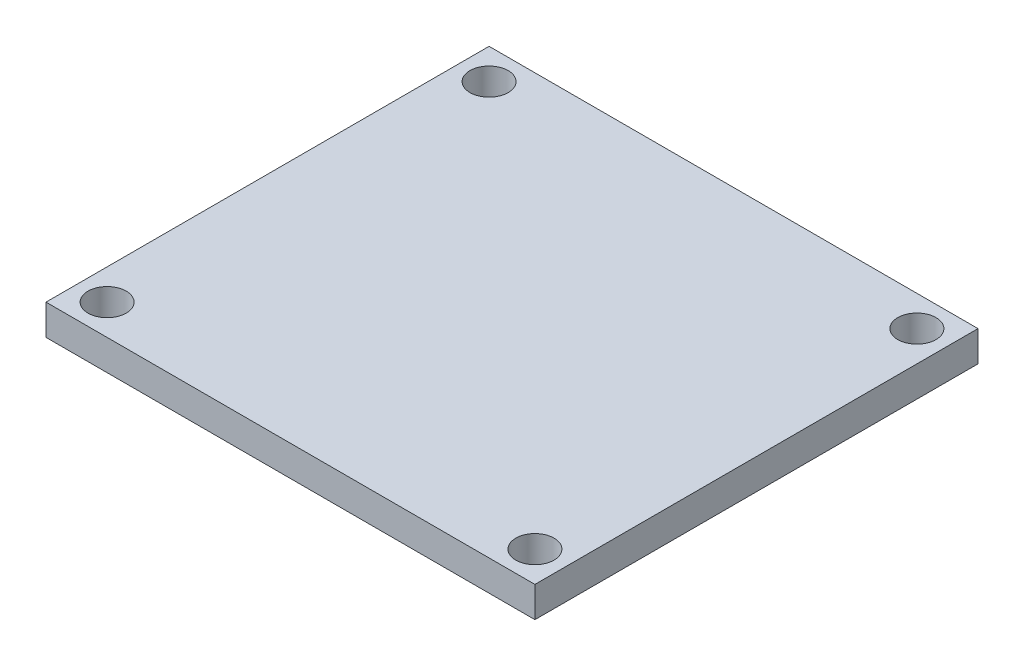
ISO-10303-21;
HEADER;
FILE_DESCRIPTION(('STEP AP214'),'2;1');
FILE_NAME('part.step','',(''),(''),'','','');
FILE_SCHEMA(('AUTOMOTIVE_DESIGN { 1 0 10303 214 1 1 1 1 }'));
ENDSEC;
DATA;
#1=APPLICATION_CONTEXT('core data for automotive mechanical design processes');
#2=APPLICATION_PROTOCOL_DEFINITION('international standard','automotive_design',2000,#1);
#3=PRODUCT_CONTEXT('',#1,'mechanical');
#4=PRODUCT('Part','Part','',(#3));
#5=PRODUCT_RELATED_PRODUCT_CATEGORY('part','',(#4));
#6=PRODUCT_DEFINITION_FORMATION('','',#4);
#7=PRODUCT_DEFINITION_CONTEXT('part definition',#1,'design');
#8=PRODUCT_DEFINITION('design','',#6,#7);
#9=PRODUCT_DEFINITION_SHAPE('','',#8);
#10=(LENGTH_UNIT() NAMED_UNIT(*) SI_UNIT(.MILLI.,.METRE.));
#11=(NAMED_UNIT(*) PLANE_ANGLE_UNIT() SI_UNIT($,.RADIAN.));
#12=(NAMED_UNIT(*) SI_UNIT($,.STERADIAN.) SOLID_ANGLE_UNIT());
#13=UNCERTAINTY_MEASURE_WITH_UNIT(LENGTH_MEASURE(1.E-05),#10,'distance_accuracy_value','');
#14=(GEOMETRIC_REPRESENTATION_CONTEXT(3) GLOBAL_UNCERTAINTY_ASSIGNED_CONTEXT((#13)) GLOBAL_UNIT_ASSIGNED_CONTEXT((#10,
#11,#12)) REPRESENTATION_CONTEXT('',''));
#15=CARTESIAN_POINT('',(0.,0.,0.));
#16=DIRECTION('',(0.,0.,1.));
#17=DIRECTION('',(1.,0.,0.));
#18=AXIS2_PLACEMENT_3D('',#15,#16,#17);
#19=CARTESIAN_POINT('',(0.,2.54,0.));
#20=DIRECTION('',(0.,1.,0.));
#21=DIRECTION('',(0.,0.,1.));
#22=AXIS2_PLACEMENT_3D('',#19,#20,#21);
#23=PLANE('',#22);
#24=CARTESIAN_POINT('',(38.1,2.54,2.54));
#25=DIRECTION('',(0.,1.,0.));
#26=DIRECTION('',(0.,0.,1.));
#27=AXIS2_PLACEMENT_3D('',#24,#25,#26);
#28=CIRCLE('',#27,1.5875);
#29=CARTESIAN_POINT('',(38.1,2.54,4.1275));
#30=VERTEX_POINT('',#29);
#31=EDGE_CURVE('E142',#30,#30,#28,.T.);
#32=ORIENTED_EDGE('',*,*,#31,.F.);
#33=EDGE_LOOP('',(#32));
#34=FACE_BOUND('',#33,.T.);
#35=CARTESIAN_POINT('',(2.54,2.54,2.54));
#36=DIRECTION('',(0.,1.,0.));
#37=DIRECTION('',(0.,0.,1.));
#38=AXIS2_PLACEMENT_3D('',#35,#36,#37);
#39=CIRCLE('',#38,1.58750000000004);
#40=CARTESIAN_POINT('',(2.54,2.54,4.12750000000004));
#41=VERTEX_POINT('',#40);
#42=EDGE_CURVE('E112',#41,#41,#39,.T.);
#43=ORIENTED_EDGE('',*,*,#42,.F.);
#44=EDGE_LOOP('',(#43));
#45=FACE_BOUND('',#44,.T.);
#46=DIRECTION('',(0.,0.,1.));
#47=VECTOR('',#46,1.);
#48=CARTESIAN_POINT('',(0.,2.54,0.));
#49=LINE('',#48,#47);
#50=CARTESIAN_POINT('',(0.,2.54,0.));
#51=VERTEX_POINT('',#50);
#52=CARTESIAN_POINT('',(0.,2.54,36.83));
#53=VERTEX_POINT('',#52);
#54=EDGE_CURVE('E92',#51,#53,#49,.T.);
#55=ORIENTED_EDGE('',*,*,#54,.T.);
#56=DIRECTION('',(1.,0.,0.));
#57=VECTOR('',#56,1.);
#58=CARTESIAN_POINT('',(0.,2.54,36.83));
#59=LINE('',#58,#57);
#60=CARTESIAN_POINT('',(40.64,2.54,36.83));
#61=VERTEX_POINT('',#60);
#62=EDGE_CURVE('E87',#53,#61,#59,.T.);
#63=ORIENTED_EDGE('',*,*,#62,.T.);
#64=DIRECTION('',(0.,0.,-1.));
#65=VECTOR('',#64,1.);
#66=CARTESIAN_POINT('',(40.64,2.54,0.));
#67=LINE('',#66,#65);
#68=CARTESIAN_POINT('',(40.64,2.54,0.));
#69=VERTEX_POINT('',#68);
#70=EDGE_CURVE('E90',#61,#69,#67,.T.);
#71=ORIENTED_EDGE('',*,*,#70,.T.);
#72=DIRECTION('',(-1.,0.,0.));
#73=VECTOR('',#72,1.);
#74=CARTESIAN_POINT('',(0.,2.54,0.));
#75=LINE('',#74,#73);
#76=EDGE_CURVE('E57',#69,#51,#75,.T.);
#77=ORIENTED_EDGE('',*,*,#76,.T.);
#78=EDGE_LOOP('',(#55,#63,#71,#77));
#79=FACE_BOUND('',#78,.T.);
#80=CARTESIAN_POINT('',(2.54,2.54,34.29));
#81=DIRECTION('',(0.,1.,0.));
#82=DIRECTION('',(0.,0.,1.));
#83=AXIS2_PLACEMENT_3D('',#80,#81,#82);
#84=CIRCLE('',#83,1.5875);
#85=CARTESIAN_POINT('',(2.54,2.54,35.8775));
#86=VERTEX_POINT('',#85);
#87=EDGE_CURVE('E134',#86,#86,#84,.T.);
#88=ORIENTED_EDGE('',*,*,#87,.F.);
#89=EDGE_LOOP('',(#88));
#90=FACE_BOUND('',#89,.T.);
#91=CARTESIAN_POINT('',(38.1,2.54,34.29));
#92=DIRECTION('',(0.,1.,0.));
#93=DIRECTION('',(0.,0.,1.));
#94=AXIS2_PLACEMENT_3D('',#91,#92,#93);
#95=CIRCLE('',#94,1.58750000000001);
#96=CARTESIAN_POINT('',(38.1,2.54,35.8775));
#97=VERTEX_POINT('',#96);
#98=EDGE_CURVE('E150',#97,#97,#95,.T.);
#99=ORIENTED_EDGE('',*,*,#98,.F.);
#100=EDGE_LOOP('',(#99));
#101=FACE_BOUND('',#100,.T.);
#102=ADVANCED_FACE('F39',(#34,#45,#79,#90,#101),#23,.T.);
#103=CARTESIAN_POINT('',(0.,0.,0.));
#104=DIRECTION('',(0.,1.,0.));
#105=DIRECTION('',(0.,0.,1.));
#106=AXIS2_PLACEMENT_3D('',#103,#104,#105);
#107=PLANE('',#106);
#108=DIRECTION('',(0.,0.,1.));
#109=VECTOR('',#108,1.);
#110=CARTESIAN_POINT('',(0.,0.,0.));
#111=LINE('',#110,#109);
#112=CARTESIAN_POINT('',(0.,0.,0.));
#113=VERTEX_POINT('',#112);
#114=CARTESIAN_POINT('',(0.,0.,36.83));
#115=VERTEX_POINT('',#114);
#116=EDGE_CURVE('E108',#113,#115,#111,.T.);
#117=ORIENTED_EDGE('',*,*,#116,.F.);
#118=DIRECTION('',(-1.,0.,0.));
#119=VECTOR('',#118,1.);
#120=CARTESIAN_POINT('',(0.,0.,0.));
#121=LINE('',#120,#119);
#122=CARTESIAN_POINT('',(40.64,0.,0.));
#123=VERTEX_POINT('',#122);
#124=EDGE_CURVE('E80',#123,#113,#121,.T.);
#125=ORIENTED_EDGE('',*,*,#124,.F.);
#126=DIRECTION('',(0.,0.,-1.));
#127=VECTOR('',#126,1.);
#128=CARTESIAN_POINT('',(40.64,0.,0.));
#129=LINE('',#128,#127);
#130=CARTESIAN_POINT('',(40.64,0.,36.83));
#131=VERTEX_POINT('',#130);
#132=EDGE_CURVE('E74',#131,#123,#129,.T.);
#133=ORIENTED_EDGE('',*,*,#132,.F.);
#134=DIRECTION('',(1.,0.,0.));
#135=VECTOR('',#134,1.);
#136=CARTESIAN_POINT('',(0.,0.,36.83));
#137=LINE('',#136,#135);
#138=EDGE_CURVE('E97',#115,#131,#137,.T.);
#139=ORIENTED_EDGE('',*,*,#138,.F.);
#140=EDGE_LOOP('',(#117,#125,#133,#139));
#141=FACE_BOUND('',#140,.T.);
#142=CARTESIAN_POINT('',(2.54,0.,2.54));
#143=DIRECTION('',(0.,1.,0.));
#144=DIRECTION('',(0.,0.,1.));
#145=AXIS2_PLACEMENT_3D('',#142,#143,#144);
#146=CIRCLE('',#145,1.58750000000004);
#147=CARTESIAN_POINT('',(2.54,0.,4.12750000000004));
#148=VERTEX_POINT('',#147);
#149=EDGE_CURVE('E130',#148,#148,#146,.T.);
#150=ORIENTED_EDGE('',*,*,#149,.T.);
#151=EDGE_LOOP('',(#150));
#152=FACE_BOUND('',#151,.T.);
#153=CARTESIAN_POINT('',(2.54,0.,34.29));
#154=DIRECTION('',(0.,1.,0.));
#155=DIRECTION('',(0.,0.,1.));
#156=AXIS2_PLACEMENT_3D('',#153,#154,#155);
#157=CIRCLE('',#156,1.5875);
#158=CARTESIAN_POINT('',(2.54,0.,35.8775));
#159=VERTEX_POINT('',#158);
#160=EDGE_CURVE('E138',#159,#159,#157,.T.);
#161=ORIENTED_EDGE('',*,*,#160,.T.);
#162=EDGE_LOOP('',(#161));
#163=FACE_BOUND('',#162,.T.);
#164=CARTESIAN_POINT('',(38.1,0.,2.54));
#165=DIRECTION('',(0.,1.,0.));
#166=DIRECTION('',(0.,0.,1.));
#167=AXIS2_PLACEMENT_3D('',#164,#165,#166);
#168=CIRCLE('',#167,1.5875);
#169=CARTESIAN_POINT('',(38.1,0.,4.1275));
#170=VERTEX_POINT('',#169);
#171=EDGE_CURVE('E146',#170,#170,#168,.T.);
#172=ORIENTED_EDGE('',*,*,#171,.T.);
#173=EDGE_LOOP('',(#172));
#174=FACE_BOUND('',#173,.T.);
#175=CARTESIAN_POINT('',(38.1,0.,34.29));
#176=DIRECTION('',(0.,1.,0.));
#177=DIRECTION('',(0.,0.,1.));
#178=AXIS2_PLACEMENT_3D('',#175,#176,#177);
#179=CIRCLE('',#178,1.58750000000001);
#180=CARTESIAN_POINT('',(38.1,0.,35.8775));
#181=VERTEX_POINT('',#180);
#182=EDGE_CURVE('E154',#181,#181,#179,.T.);
#183=ORIENTED_EDGE('',*,*,#182,.T.);
#184=EDGE_LOOP('',(#183));
#185=FACE_BOUND('',#184,.T.);
#186=ADVANCED_FACE('F125',(#141,#152,#163,#174,#185),#107,.F.);
#187=CARTESIAN_POINT('',(0.,2.54,0.));
#188=DIRECTION('',(1.,0.,0.));
#189=DIRECTION('',(0.,0.,-1.));
#190=AXIS2_PLACEMENT_3D('',#187,#188,#189);
#191=PLANE('',#190);
#192=ORIENTED_EDGE('',*,*,#116,.T.);
#193=DIRECTION('',(0.,-1.,0.));
#194=VECTOR('',#193,1.);
#195=CARTESIAN_POINT('',(0.,2.54,36.83));
#196=LINE('',#195,#194);
#197=EDGE_CURVE('E11',#53,#115,#196,.T.);
#198=ORIENTED_EDGE('',*,*,#197,.F.);
#199=ORIENTED_EDGE('',*,*,#54,.F.);
#200=DIRECTION('',(0.,-1.,0.));
#201=VECTOR('',#200,1.);
#202=CARTESIAN_POINT('',(0.,2.54,0.));
#203=LINE('',#202,#201);
#204=EDGE_CURVE('E104',#51,#113,#203,.T.);
#205=ORIENTED_EDGE('',*,*,#204,.T.);
#206=EDGE_LOOP('',(#192,#198,#199,#205));
#207=FACE_BOUND('',#206,.T.);
#208=ADVANCED_FACE('F41',(#207),#191,.F.);
#209=CARTESIAN_POINT('',(0.,2.54,36.83));
#210=DIRECTION('',(0.,0.,-1.));
#211=DIRECTION('',(-1.,0.,0.));
#212=AXIS2_PLACEMENT_3D('',#209,#210,#211);
#213=PLANE('',#212);
#214=ORIENTED_EDGE('',*,*,#138,.T.);
#215=DIRECTION('',(0.,-1.,0.));
#216=VECTOR('',#215,1.);
#217=CARTESIAN_POINT('',(40.64,2.54,36.83));
#218=LINE('',#217,#216);
#219=EDGE_CURVE('E49',#61,#131,#218,.T.);
#220=ORIENTED_EDGE('',*,*,#219,.F.);
#221=ORIENTED_EDGE('',*,*,#62,.F.);
#222=ORIENTED_EDGE('',*,*,#197,.T.);
#223=EDGE_LOOP('',(#214,#220,#221,#222));
#224=FACE_BOUND('',#223,.T.);
#225=ADVANCED_FACE('F96',(#224),#213,.F.);
#226=CARTESIAN_POINT('',(40.64,2.54,0.));
#227=DIRECTION('',(-1.,0.,0.));
#228=DIRECTION('',(0.,0.,1.));
#229=AXIS2_PLACEMENT_3D('',#226,#227,#228);
#230=PLANE('',#229);
#231=ORIENTED_EDGE('',*,*,#132,.T.);
#232=DIRECTION('',(0.,-1.,0.));
#233=VECTOR('',#232,1.);
#234=CARTESIAN_POINT('',(40.64,2.54,0.));
#235=LINE('',#234,#233);
#236=EDGE_CURVE('E99',#69,#123,#235,.T.);
#237=ORIENTED_EDGE('',*,*,#236,.F.);
#238=ORIENTED_EDGE('',*,*,#70,.F.);
#239=ORIENTED_EDGE('',*,*,#219,.T.);
#240=EDGE_LOOP('',(#231,#237,#238,#239));
#241=FACE_BOUND('',#240,.T.);
#242=ADVANCED_FACE('F100',(#241),#230,.F.);
#243=CARTESIAN_POINT('',(0.,2.54,0.));
#244=DIRECTION('',(0.,0.,1.));
#245=DIRECTION('',(1.,0.,0.));
#246=AXIS2_PLACEMENT_3D('',#243,#244,#245);
#247=PLANE('',#246);
#248=ORIENTED_EDGE('',*,*,#124,.T.);
#249=ORIENTED_EDGE('',*,*,#204,.F.);
#250=ORIENTED_EDGE('',*,*,#76,.F.);
#251=ORIENTED_EDGE('',*,*,#236,.T.);
#252=EDGE_LOOP('',(#248,#249,#250,#251));
#253=FACE_BOUND('',#252,.T.);
#254=ADVANCED_FACE('F122',(#253),#247,.F.);
#255=CARTESIAN_POINT('',(2.54,2.54,2.54));
#256=DIRECTION('',(0.,-1.,0.));
#257=DIRECTION('',(0.,0.,-1.));
#258=AXIS2_PLACEMENT_3D('',#255,#256,#257);
#259=CYLINDRICAL_SURFACE('',#258,1.58750000000004);
#260=ORIENTED_EDGE('',*,*,#42,.T.);
#261=EDGE_LOOP('',(#260));
#262=FACE_BOUND('',#261,.T.);
#263=ORIENTED_EDGE('',*,*,#149,.F.);
#264=EDGE_LOOP('',(#263));
#265=FACE_BOUND('',#264,.T.);
#266=ADVANCED_FACE('F175',(#262,#265),#259,.F.);
#267=CARTESIAN_POINT('',(2.54,2.54,34.29));
#268=DIRECTION('',(0.,-1.,0.));
#269=DIRECTION('',(0.,0.,-1.));
#270=AXIS2_PLACEMENT_3D('',#267,#268,#269);
#271=CYLINDRICAL_SURFACE('',#270,1.5875);
#272=ORIENTED_EDGE('',*,*,#87,.T.);
#273=EDGE_LOOP('',(#272));
#274=FACE_BOUND('',#273,.T.);
#275=ORIENTED_EDGE('',*,*,#160,.F.);
#276=EDGE_LOOP('',(#275));
#277=FACE_BOUND('',#276,.T.);
#278=ADVANCED_FACE('F221',(#274,#277),#271,.F.);
#279=CARTESIAN_POINT('',(38.1,2.54,2.54));
#280=DIRECTION('',(0.,-1.,0.));
#281=DIRECTION('',(0.,0.,-1.));
#282=AXIS2_PLACEMENT_3D('',#279,#280,#281);
#283=CYLINDRICAL_SURFACE('',#282,1.5875);
#284=ORIENTED_EDGE('',*,*,#31,.T.);
#285=EDGE_LOOP('',(#284));
#286=FACE_BOUND('',#285,.T.);
#287=ORIENTED_EDGE('',*,*,#171,.F.);
#288=EDGE_LOOP('',(#287));
#289=FACE_BOUND('',#288,.T.);
#290=ADVANCED_FACE('F229',(#286,#289),#283,.F.);
#291=CARTESIAN_POINT('',(38.1,2.54,34.29));
#292=DIRECTION('',(0.,-1.,0.));
#293=DIRECTION('',(0.,0.,-1.));
#294=AXIS2_PLACEMENT_3D('',#291,#292,#293);
#295=CYLINDRICAL_SURFACE('',#294,1.58750000000001);
#296=ORIENTED_EDGE('',*,*,#98,.T.);
#297=EDGE_LOOP('',(#296));
#298=FACE_BOUND('',#297,.T.);
#299=ORIENTED_EDGE('',*,*,#182,.F.);
#300=EDGE_LOOP('',(#299));
#301=FACE_BOUND('',#300,.T.);
#302=ADVANCED_FACE('F162',(#298,#301),#295,.F.);
#303=CLOSED_SHELL('',(#102,#186,#208,#225,#242,#254,#266,#278,#290,#302));
#304=MANIFOLD_SOLID_BREP('B2',#303);
#305=ADVANCED_BREP_SHAPE_REPRESENTATION('',(#18,#304),#14);
#306=SHAPE_DEFINITION_REPRESENTATION(#9,#305);
ENDSEC;
END-ISO-10303-21;
